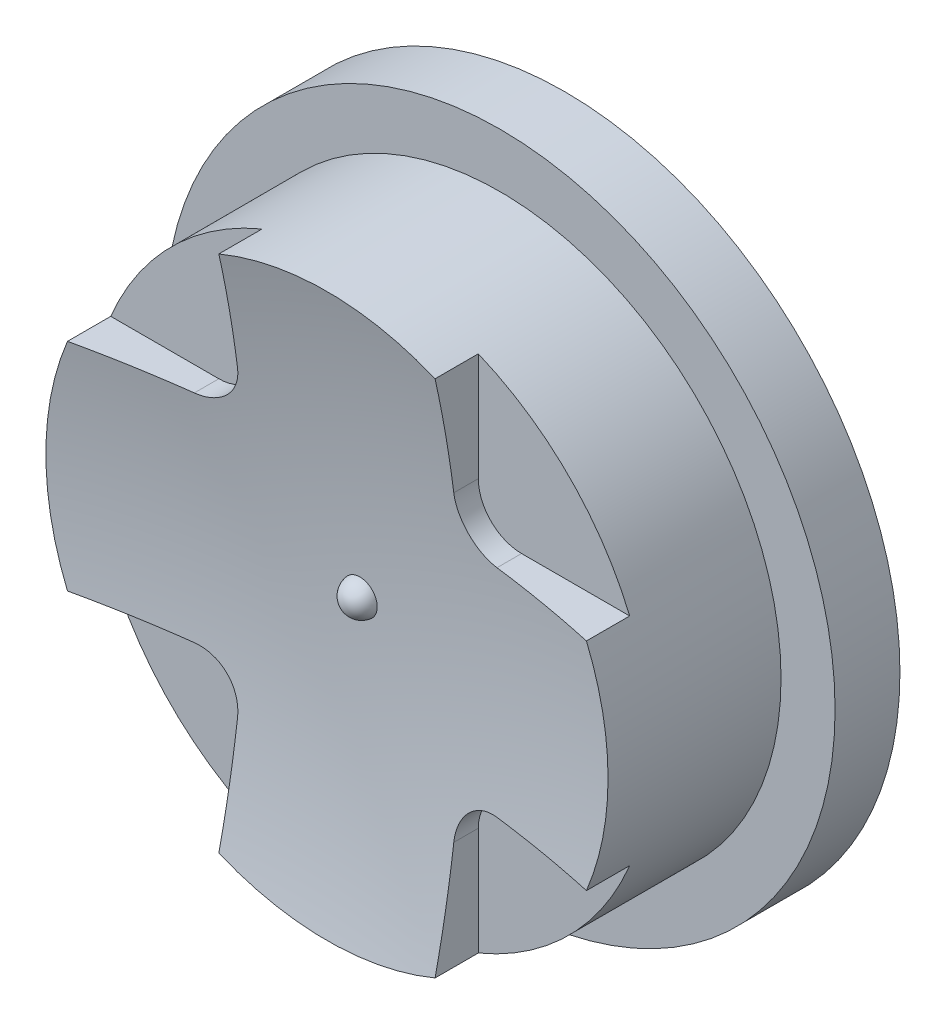
ISO-10303-21;
HEADER;
FILE_DESCRIPTION(('STEP AP214'),'2;1');
FILE_NAME('part.step','',(''),(''),'','','');
FILE_SCHEMA(('AUTOMOTIVE_DESIGN { 1 0 10303 214 1 1 1 1 }'));
ENDSEC;
DATA;
#1=APPLICATION_CONTEXT('core data for automotive mechanical design processes');
#2=APPLICATION_PROTOCOL_DEFINITION('international standard','automotive_design',2000,#1);
#3=PRODUCT_CONTEXT('',#1,'mechanical');
#4=PRODUCT('Part','Part','',(#3));
#5=PRODUCT_RELATED_PRODUCT_CATEGORY('part','',(#4));
#6=PRODUCT_DEFINITION_FORMATION('','',#4);
#7=PRODUCT_DEFINITION_CONTEXT('part definition',#1,'design');
#8=PRODUCT_DEFINITION('design','',#6,#7);
#9=PRODUCT_DEFINITION_SHAPE('','',#8);
#10=(LENGTH_UNIT() NAMED_UNIT(*) SI_UNIT(.MILLI.,.METRE.));
#11=(NAMED_UNIT(*) PLANE_ANGLE_UNIT() SI_UNIT($,.RADIAN.));
#12=(NAMED_UNIT(*) SI_UNIT($,.STERADIAN.) SOLID_ANGLE_UNIT());
#13=UNCERTAINTY_MEASURE_WITH_UNIT(LENGTH_MEASURE(1.E-05),#10,'distance_accuracy_value','');
#14=(GEOMETRIC_REPRESENTATION_CONTEXT(3) GLOBAL_UNCERTAINTY_ASSIGNED_CONTEXT((#13)) GLOBAL_UNIT_ASSIGNED_CONTEXT((#10,
#11,#12)) REPRESENTATION_CONTEXT('',''));
#15=CARTESIAN_POINT('',(0.,0.,0.));
#16=DIRECTION('',(0.,0.,1.));
#17=DIRECTION('',(1.,0.,0.));
#18=AXIS2_PLACEMENT_3D('',#15,#16,#17);
#19=CARTESIAN_POINT('',(0.,0.,5.5));
#20=DIRECTION('',(0.,0.,-1.));
#21=DIRECTION('',(-1.,0.,0.));
#22=AXIS2_PLACEMENT_3D('',#19,#20,#21);
#23=CYLINDRICAL_SURFACE('',#22,6.5);
#24=CARTESIAN_POINT('',(0.,0.,1.5));
#25=DIRECTION('',(0.,0.,1.));
#26=DIRECTION('',(1.,0.,0.));
#27=AXIS2_PLACEMENT_3D('',#24,#25,#26);
#28=CIRCLE('',#27,6.5);
#29=CARTESIAN_POINT('',(6.5,0.,1.5));
#30=VERTEX_POINT('',#29);
#31=EDGE_CURVE('E240',#30,#30,#28,.T.);
#32=ORIENTED_EDGE('',*,*,#31,.T.);
#33=EDGE_LOOP('',(#32));
#34=FACE_BOUND('',#33,.T.);
#35=DIRECTION('',(0.,0.,-1.));
#36=VECTOR('',#35,1.);
#37=CARTESIAN_POINT('',(2.5,6.,5.5));
#38=LINE('',#37,#36);
#39=CARTESIAN_POINT('',(2.5,6.,4.5));
#40=VERTEX_POINT('',#39);
#41=CARTESIAN_POINT('',(2.5,5.99999999999987,5.49999999999994));
#42=VERTEX_POINT('',#41);
#43=EDGE_CURVE('E165',#40,#42,#38,.F.);
#44=ORIENTED_EDGE('',*,*,#43,.F.);
#45=CARTESIAN_POINT('',(0.,0.,4.5));
#46=DIRECTION('',(0.,0.,1.));
#47=DIRECTION('',(1.,0.,0.));
#48=AXIS2_PLACEMENT_3D('',#45,#46,#47);
#49=CIRCLE('',#48,6.5);
#50=CARTESIAN_POINT('',(6.,2.5,4.5));
#51=VERTEX_POINT('',#50);
#52=EDGE_CURVE('E229',#51,#40,#49,.T.);
#53=ORIENTED_EDGE('',*,*,#52,.F.);
#54=DIRECTION('',(0.,0.,-1.));
#55=VECTOR('',#54,1.);
#56=CARTESIAN_POINT('',(6.,2.5,5.5));
#57=LINE('',#56,#55);
#58=CARTESIAN_POINT('',(6.,2.5,5.5));
#59=VERTEX_POINT('',#58);
#60=EDGE_CURVE('E173',#59,#51,#57,.T.);
#61=ORIENTED_EDGE('',*,*,#60,.F.);
#62=CARTESIAN_POINT('',(0.,0.,5.5));
#63=DIRECTION('',(0.,0.,1.));
#64=DIRECTION('',(1.,0.,0.));
#65=AXIS2_PLACEMENT_3D('',#62,#63,#64);
#66=CIRCLE('',#65,6.5);
#67=CARTESIAN_POINT('',(5.99999999999984,-2.5,5.49999999999993));
#68=VERTEX_POINT('',#67);
#69=EDGE_CURVE('E172',#68,#59,#66,.T.);
#70=ORIENTED_EDGE('',*,*,#69,.F.);
#71=DIRECTION('',(0.,0.,-1.));
#72=VECTOR('',#71,1.);
#73=CARTESIAN_POINT('',(6.,-2.5,5.5));
#74=LINE('',#73,#72);
#75=CARTESIAN_POINT('',(6.,-2.5,4.5));
#76=VERTEX_POINT('',#75);
#77=EDGE_CURVE('E209',#76,#68,#74,.F.);
#78=ORIENTED_EDGE('',*,*,#77,.F.);
#79=CARTESIAN_POINT('',(2.5,-6.,4.5));
#80=VERTEX_POINT('',#79);
#81=EDGE_CURVE('E208',#80,#76,#49,.T.);
#82=ORIENTED_EDGE('',*,*,#81,.F.);
#83=DIRECTION('',(0.,0.,-1.));
#84=VECTOR('',#83,1.);
#85=CARTESIAN_POINT('',(2.5,-6.,5.5));
#86=LINE('',#85,#84);
#87=CARTESIAN_POINT('',(2.5,-5.99999999999987,5.49999999999994));
#88=VERTEX_POINT('',#87);
#89=EDGE_CURVE('E200',#88,#80,#86,.T.);
#90=ORIENTED_EDGE('',*,*,#89,.F.);
#91=CARTESIAN_POINT('',(-2.5,-5.9999999999999,5.49999999999996));
#92=VERTEX_POINT('',#91);
#93=EDGE_CURVE('E184',#92,#88,#66,.T.);
#94=ORIENTED_EDGE('',*,*,#93,.F.);
#95=DIRECTION('',(0.,0.,-1.));
#96=VECTOR('',#95,1.);
#97=CARTESIAN_POINT('',(-2.5,-6.,5.5));
#98=LINE('',#97,#96);
#99=CARTESIAN_POINT('',(-2.5,-6.,4.5));
#100=VERTEX_POINT('',#99);
#101=EDGE_CURVE('E210',#100,#92,#98,.F.);
#102=ORIENTED_EDGE('',*,*,#101,.F.);
#103=CARTESIAN_POINT('',(-6.,-2.5,4.5));
#104=VERTEX_POINT('',#103);
#105=EDGE_CURVE('E238',#104,#100,#49,.T.);
#106=ORIENTED_EDGE('',*,*,#105,.F.);
#107=DIRECTION('',(0.,0.,-1.));
#108=VECTOR('',#107,1.);
#109=CARTESIAN_POINT('',(-6.,-2.5,5.5));
#110=LINE('',#109,#108);
#111=CARTESIAN_POINT('',(-5.99999999999992,-2.5,5.49999999999997));
#112=VERTEX_POINT('',#111);
#113=EDGE_CURVE('E214',#112,#104,#110,.T.);
#114=ORIENTED_EDGE('',*,*,#113,.F.);
#115=CARTESIAN_POINT('',(-5.99999999999992,2.5,5.49999999999997));
#116=VERTEX_POINT('',#115);
#117=EDGE_CURVE('E179',#116,#112,#66,.T.);
#118=ORIENTED_EDGE('',*,*,#117,.F.);
#119=DIRECTION('',(0.,0.,-1.));
#120=VECTOR('',#119,1.);
#121=CARTESIAN_POINT('',(-6.,2.5,5.5));
#122=LINE('',#121,#120);
#123=CARTESIAN_POINT('',(-6.,2.5,4.5));
#124=VERTEX_POINT('',#123);
#125=EDGE_CURVE('E388',#124,#116,#122,.F.);
#126=ORIENTED_EDGE('',*,*,#125,.F.);
#127=CARTESIAN_POINT('',(-2.5,6.,4.5));
#128=VERTEX_POINT('',#127);
#129=EDGE_CURVE('E235',#128,#124,#49,.T.);
#130=ORIENTED_EDGE('',*,*,#129,.F.);
#131=DIRECTION('',(0.,0.,-1.));
#132=VECTOR('',#131,1.);
#133=CARTESIAN_POINT('',(-2.5,6.,5.5));
#134=LINE('',#133,#132);
#135=CARTESIAN_POINT('',(-2.5,5.9999999999999,5.49999999999996));
#136=VERTEX_POINT('',#135);
#137=EDGE_CURVE('E177',#136,#128,#134,.T.);
#138=ORIENTED_EDGE('',*,*,#137,.F.);
#139=EDGE_CURVE('E155',#42,#136,#66,.T.);
#140=ORIENTED_EDGE('',*,*,#139,.F.);
#141=EDGE_LOOP('',(#44,#53,#61,#70,#78,#82,#90,#94,#102,#106,#114,#118,#126,#130,#138,#140));
#142=FACE_BOUND('',#141,.T.);
#143=ADVANCED_FACE('F35',(#34,#142),#23,.T.);
#144=CARTESIAN_POINT('',(0.,0.,1.5));
#145=DIRECTION('',(0.,0.,-1.));
#146=DIRECTION('',(-1.,0.,0.));
#147=AXIS2_PLACEMENT_3D('',#144,#145,#146);
#148=CYLINDRICAL_SURFACE('',#147,7.75);
#149=CARTESIAN_POINT('',(0.,0.,1.5));
#150=DIRECTION('',(0.,0.,1.));
#151=DIRECTION('',(1.,0.,0.));
#152=AXIS2_PLACEMENT_3D('',#149,#150,#151);
#153=CIRCLE('',#152,7.75);
#154=CARTESIAN_POINT('',(7.75,0.,1.5));
#155=VERTEX_POINT('',#154);
#156=EDGE_CURVE('E182',#155,#155,#153,.T.);
#157=ORIENTED_EDGE('',*,*,#156,.F.);
#158=EDGE_LOOP('',(#157));
#159=FACE_BOUND('',#158,.T.);
#160=CARTESIAN_POINT('',(0.,0.,0.));
#161=DIRECTION('',(0.,0.,1.));
#162=DIRECTION('',(1.,0.,0.));
#163=AXIS2_PLACEMENT_3D('',#160,#161,#162);
#164=CIRCLE('',#163,7.75);
#165=CARTESIAN_POINT('',(7.75,0.,0.));
#166=VERTEX_POINT('',#165);
#167=EDGE_CURVE('E178',#166,#166,#164,.T.);
#168=ORIENTED_EDGE('',*,*,#167,.T.);
#169=EDGE_LOOP('',(#168));
#170=FACE_BOUND('',#169,.T.);
#171=ADVANCED_FACE('F255',(#159,#170),#148,.T.);
#172=CARTESIAN_POINT('',(0.,0.,1.5));
#173=DIRECTION('',(0.,0.,1.));
#174=DIRECTION('',(1.,0.,0.));
#175=AXIS2_PLACEMENT_3D('',#172,#173,#174);
#176=PLANE('',#175);
#177=ORIENTED_EDGE('',*,*,#31,.F.);
#178=EDGE_LOOP('',(#177));
#179=FACE_BOUND('',#178,.T.);
#180=ORIENTED_EDGE('',*,*,#156,.T.);
#181=EDGE_LOOP('',(#180));
#182=FACE_BOUND('',#181,.T.);
#183=ADVANCED_FACE('F253',(#179,#182),#176,.T.);
#184=CARTESIAN_POINT('',(0.,0.,0.));
#185=DIRECTION('',(0.,0.,1.));
#186=DIRECTION('',(1.,0.,0.));
#187=AXIS2_PLACEMENT_3D('',#184,#185,#186);
#188=PLANE('',#187);
#189=ORIENTED_EDGE('',*,*,#167,.F.);
#190=EDGE_LOOP('',(#189));
#191=FACE_BOUND('',#190,.T.);
#192=ADVANCED_FACE('F261',(#191),#188,.F.);
#193=CARTESIAN_POINT('',(-2.5,7.5,4.5));
#194=DIRECTION('',(-1.,0.,0.));
#195=DIRECTION('',(0.,0.,1.));
#196=AXIS2_PLACEMENT_3D('',#193,#194,#195);
#197=PLANE('',#196);
#198=DIRECTION('',(0.,-1.,0.));
#199=VECTOR('',#198,1.);
#200=CARTESIAN_POINT('',(-2.5,7.5,4.5));
#201=LINE('',#200,#199);
#202=CARTESIAN_POINT('',(-2.5,3.5,4.5));
#203=VERTEX_POINT('',#202);
#204=EDGE_CURVE('E394',#128,#203,#201,.T.);
#205=ORIENTED_EDGE('',*,*,#204,.T.);
#206=DIRECTION('',(0.,0.,1.));
#207=VECTOR('',#206,1.);
#208=CARTESIAN_POINT('',(-2.5,3.5,4.95919883813034));
#209=LINE('',#208,#207);
#210=CARTESIAN_POINT('',(-2.5,3.5,5.06741699827879));
#211=VERTEX_POINT('',#210);
#212=EDGE_CURVE('E357',#203,#211,#209,.T.);
#213=ORIENTED_EDGE('',*,*,#212,.T.);
#214=CARTESIAN_POINT('',(-2.5,0.,32.7350876627926));
#215=DIRECTION('',(-1.,0.,0.));
#216=DIRECTION('',(0.,0.,1.));
#217=AXIS2_PLACEMENT_3D('',#214,#215,#216);
#218=CIRCLE('',#217,27.8881695347687);
#219=EDGE_CURVE('E385',#136,#211,#218,.T.);
#220=ORIENTED_EDGE('',*,*,#219,.F.);
#221=ORIENTED_EDGE('',*,*,#137,.T.);
#222=EDGE_LOOP('',(#205,#213,#220,#221));
#223=FACE_BOUND('',#222,.T.);
#224=ADVANCED_FACE('F263',(#223),#197,.T.);
#225=CARTESIAN_POINT('',(-2.5,2.5,4.5));
#226=DIRECTION('',(0.,1.,0.));
#227=DIRECTION('',(-1.,0.,0.));
#228=AXIS2_PLACEMENT_3D('',#225,#226,#227);
#229=PLANE('',#228);
#230=CARTESIAN_POINT('',(0.,2.5,32.7350876627926));
#231=DIRECTION('',(0.,1.,0.));
#232=DIRECTION('',(-1.,0.,0.));
#233=AXIS2_PLACEMENT_3D('',#230,#231,#232);
#234=CIRCLE('',#233,27.8881695347687);
#235=CARTESIAN_POINT('',(-3.5,2.5,5.06741699827879));
#236=VERTEX_POINT('',#235);
#237=EDGE_CURVE('E383',#236,#116,#234,.T.);
#238=ORIENTED_EDGE('',*,*,#237,.F.);
#239=DIRECTION('',(0.,0.,1.));
#240=VECTOR('',#239,1.);
#241=CARTESIAN_POINT('',(-3.5,2.5,4.5));
#242=LINE('',#241,#240);
#243=CARTESIAN_POINT('',(-3.5,2.5,4.5));
#244=VERTEX_POINT('',#243);
#245=EDGE_CURVE('E360',#236,#244,#242,.F.);
#246=ORIENTED_EDGE('',*,*,#245,.T.);
#247=DIRECTION('',(-1.,0.,0.));
#248=VECTOR('',#247,1.);
#249=CARTESIAN_POINT('',(-2.5,2.5,4.5));
#250=LINE('',#249,#248);
#251=EDGE_CURVE('E395',#244,#124,#250,.T.);
#252=ORIENTED_EDGE('',*,*,#251,.T.);
#253=ORIENTED_EDGE('',*,*,#125,.T.);
#254=EDGE_LOOP('',(#238,#246,#252,#253));
#255=FACE_BOUND('',#254,.T.);
#256=ADVANCED_FACE('F269',(#255),#229,.T.);
#257=CARTESIAN_POINT('',(0.,0.,4.5));
#258=DIRECTION('',(0.,0.,1.));
#259=DIRECTION('',(1.,0.,0.));
#260=AXIS2_PLACEMENT_3D('',#257,#258,#259);
#261=PLANE('',#260);
#262=ORIENTED_EDGE('',*,*,#251,.F.);
#263=CARTESIAN_POINT('',(-3.5,3.5,4.5));
#264=DIRECTION('',(0.,0.,1.));
#265=DIRECTION('',(1.,0.,0.));
#266=AXIS2_PLACEMENT_3D('',#263,#264,#265);
#267=CIRCLE('',#266,1.);
#268=EDGE_CURVE('E362',#244,#203,#267,.T.);
#269=ORIENTED_EDGE('',*,*,#268,.T.);
#270=ORIENTED_EDGE('',*,*,#204,.F.);
#271=ORIENTED_EDGE('',*,*,#129,.T.);
#272=EDGE_LOOP('',(#262,#269,#270,#271));
#273=FACE_BOUND('',#272,.T.);
#274=ADVANCED_FACE('F281',(#273),#261,.T.);
#275=CARTESIAN_POINT('',(-7.5,-2.5,4.5));
#276=DIRECTION('',(0.,-1.,0.));
#277=DIRECTION('',(1.,0.,0.));
#278=AXIS2_PLACEMENT_3D('',#275,#276,#277);
#279=PLANE('',#278);
#280=DIRECTION('',(1.,0.,0.));
#281=VECTOR('',#280,1.);
#282=CARTESIAN_POINT('',(-7.5,-2.5,4.5));
#283=LINE('',#282,#281);
#284=CARTESIAN_POINT('',(-3.5,-2.5,4.5));
#285=VERTEX_POINT('',#284);
#286=EDGE_CURVE('E397',#104,#285,#283,.T.);
#287=ORIENTED_EDGE('',*,*,#286,.T.);
#288=DIRECTION('',(0.,0.,1.));
#289=VECTOR('',#288,1.);
#290=CARTESIAN_POINT('',(-3.5,-2.5,4.95919883813034));
#291=LINE('',#290,#289);
#292=CARTESIAN_POINT('',(-3.5,-2.5,5.06741699827879));
#293=VERTEX_POINT('',#292);
#294=EDGE_CURVE('E374',#285,#293,#291,.T.);
#295=ORIENTED_EDGE('',*,*,#294,.T.);
#296=CARTESIAN_POINT('',(0.,-2.5,32.7350876627926));
#297=DIRECTION('',(0.,-1.,0.));
#298=DIRECTION('',(1.,0.,0.));
#299=AXIS2_PLACEMENT_3D('',#296,#297,#298);
#300=CIRCLE('',#299,27.8881695347687);
#301=EDGE_CURVE('E390',#112,#293,#300,.T.);
#302=ORIENTED_EDGE('',*,*,#301,.F.);
#303=ORIENTED_EDGE('',*,*,#113,.T.);
#304=EDGE_LOOP('',(#287,#295,#302,#303));
#305=FACE_BOUND('',#304,.T.);
#306=ADVANCED_FACE('F286',(#305),#279,.T.);
#307=CARTESIAN_POINT('',(-2.5,-2.5,4.5));
#308=DIRECTION('',(-1.,0.,0.));
#309=DIRECTION('',(0.,0.,1.));
#310=AXIS2_PLACEMENT_3D('',#307,#308,#309);
#311=PLANE('',#310);
#312=CARTESIAN_POINT('',(-2.5,0.,32.7350876627926));
#313=DIRECTION('',(-1.,0.,0.));
#314=DIRECTION('',(0.,0.,1.));
#315=AXIS2_PLACEMENT_3D('',#312,#313,#314);
#316=CIRCLE('',#315,27.8881695347687);
#317=CARTESIAN_POINT('',(-2.5,-3.5,5.06741699827879));
#318=VERTEX_POINT('',#317);
#319=EDGE_CURVE('E192',#318,#92,#316,.T.);
#320=ORIENTED_EDGE('',*,*,#319,.F.);
#321=DIRECTION('',(0.,0.,1.));
#322=VECTOR('',#321,1.);
#323=CARTESIAN_POINT('',(-2.5,-3.5,4.5));
#324=LINE('',#323,#322);
#325=CARTESIAN_POINT('',(-2.5,-3.5,4.5));
#326=VERTEX_POINT('',#325);
#327=EDGE_CURVE('E56',#318,#326,#324,.F.);
#328=ORIENTED_EDGE('',*,*,#327,.T.);
#329=DIRECTION('',(0.,-1.,0.));
#330=VECTOR('',#329,1.);
#331=CARTESIAN_POINT('',(-2.5,-2.5,4.5));
#332=LINE('',#331,#330);
#333=EDGE_CURVE('E402',#326,#100,#332,.T.);
#334=ORIENTED_EDGE('',*,*,#333,.T.);
#335=ORIENTED_EDGE('',*,*,#101,.T.);
#336=EDGE_LOOP('',(#320,#328,#334,#335));
#337=FACE_BOUND('',#336,.T.);
#338=ADVANCED_FACE('F289',(#337),#311,.T.);
#339=ORIENTED_EDGE('',*,*,#333,.F.);
#340=CARTESIAN_POINT('',(-3.5,-3.5,4.5));
#341=DIRECTION('',(0.,0.,1.));
#342=DIRECTION('',(1.,0.,0.));
#343=AXIS2_PLACEMENT_3D('',#340,#341,#342);
#344=CIRCLE('',#343,1.);
#345=EDGE_CURVE('E377',#326,#285,#344,.T.);
#346=ORIENTED_EDGE('',*,*,#345,.T.);
#347=ORIENTED_EDGE('',*,*,#286,.F.);
#348=ORIENTED_EDGE('',*,*,#105,.T.);
#349=EDGE_LOOP('',(#339,#346,#347,#348));
#350=FACE_BOUND('',#349,.T.);
#351=ADVANCED_FACE('F293',(#350),#261,.T.);
#352=CARTESIAN_POINT('',(2.5,-7.5,4.5));
#353=DIRECTION('',(1.,0.,0.));
#354=DIRECTION('',(0.,0.,-1.));
#355=AXIS2_PLACEMENT_3D('',#352,#353,#354);
#356=PLANE('',#355);
#357=DIRECTION('',(0.,1.,0.));
#358=VECTOR('',#357,1.);
#359=CARTESIAN_POINT('',(2.5,-7.5,4.5));
#360=LINE('',#359,#358);
#361=CARTESIAN_POINT('',(2.5,-3.5,4.5));
#362=VERTEX_POINT('',#361);
#363=EDGE_CURVE('E404',#80,#362,#360,.T.);
#364=ORIENTED_EDGE('',*,*,#363,.T.);
#365=DIRECTION('',(0.,0.,1.));
#366=VECTOR('',#365,1.);
#367=CARTESIAN_POINT('',(2.5,-3.5,4.95919883813034));
#368=LINE('',#367,#366);
#369=CARTESIAN_POINT('',(2.5,-3.5,5.06741699827879));
#370=VERTEX_POINT('',#369);
#371=EDGE_CURVE('E203',#362,#370,#368,.T.);
#372=ORIENTED_EDGE('',*,*,#371,.T.);
#373=CARTESIAN_POINT('',(2.5,0.,32.7350876627926));
#374=DIRECTION('',(1.,0.,0.));
#375=DIRECTION('',(0.,0.,-1.));
#376=AXIS2_PLACEMENT_3D('',#373,#374,#375);
#377=CIRCLE('',#376,27.8881695347687);
#378=EDGE_CURVE('E191',#88,#370,#377,.T.);
#379=ORIENTED_EDGE('',*,*,#378,.F.);
#380=ORIENTED_EDGE('',*,*,#89,.T.);
#381=EDGE_LOOP('',(#364,#372,#379,#380));
#382=FACE_BOUND('',#381,.T.);
#383=ADVANCED_FACE('F199',(#382),#356,.T.);
#384=CARTESIAN_POINT('',(2.5,-2.5,4.5));
#385=DIRECTION('',(0.,-1.,0.));
#386=DIRECTION('',(1.,0.,0.));
#387=AXIS2_PLACEMENT_3D('',#384,#385,#386);
#388=PLANE('',#387);
#389=CARTESIAN_POINT('',(0.,-2.5,32.7350876627926));
#390=DIRECTION('',(0.,-1.,0.));
#391=DIRECTION('',(1.,0.,0.));
#392=AXIS2_PLACEMENT_3D('',#389,#390,#391);
#393=CIRCLE('',#392,27.8881695347687);
#394=CARTESIAN_POINT('',(3.5,-2.5,5.06741699827879));
#395=VERTEX_POINT('',#394);
#396=EDGE_CURVE('E161',#395,#68,#393,.T.);
#397=ORIENTED_EDGE('',*,*,#396,.F.);
#398=DIRECTION('',(0.,0.,1.));
#399=VECTOR('',#398,1.);
#400=CARTESIAN_POINT('',(3.5,-2.5,4.5));
#401=LINE('',#400,#399);
#402=CARTESIAN_POINT('',(3.5,-2.5,4.5));
#403=VERTEX_POINT('',#402);
#404=EDGE_CURVE('E370',#395,#403,#401,.F.);
#405=ORIENTED_EDGE('',*,*,#404,.T.);
#406=DIRECTION('',(1.,0.,0.));
#407=VECTOR('',#406,1.);
#408=CARTESIAN_POINT('',(2.5,-2.5,4.5));
#409=LINE('',#408,#407);
#410=EDGE_CURVE('E232',#403,#76,#409,.T.);
#411=ORIENTED_EDGE('',*,*,#410,.T.);
#412=ORIENTED_EDGE('',*,*,#77,.T.);
#413=EDGE_LOOP('',(#397,#405,#411,#412));
#414=FACE_BOUND('',#413,.T.);
#415=ADVANCED_FACE('F296',(#414),#388,.T.);
#416=ORIENTED_EDGE('',*,*,#410,.F.);
#417=CARTESIAN_POINT('',(3.5,-3.5,4.5));
#418=DIRECTION('',(0.,0.,1.));
#419=DIRECTION('',(1.,0.,0.));
#420=AXIS2_PLACEMENT_3D('',#417,#418,#419);
#421=CIRCLE('',#420,1.);
#422=EDGE_CURVE('E372',#403,#362,#421,.T.);
#423=ORIENTED_EDGE('',*,*,#422,.T.);
#424=ORIENTED_EDGE('',*,*,#363,.F.);
#425=ORIENTED_EDGE('',*,*,#81,.T.);
#426=EDGE_LOOP('',(#416,#423,#424,#425));
#427=FACE_BOUND('',#426,.T.);
#428=ADVANCED_FACE('F280',(#427),#261,.T.);
#429=DIRECTION('',(0.,1.,0.));
#430=VECTOR('',#429,1.);
#431=CARTESIAN_POINT('',(2.5,2.5,4.5));
#432=LINE('',#431,#430);
#433=CARTESIAN_POINT('',(2.5,3.5,4.5));
#434=VERTEX_POINT('',#433);
#435=EDGE_CURVE('E168',#434,#40,#432,.T.);
#436=ORIENTED_EDGE('',*,*,#435,.F.);
#437=CARTESIAN_POINT('',(3.5,3.5,4.5));
#438=DIRECTION('',(0.,0.,1.));
#439=DIRECTION('',(1.,0.,0.));
#440=AXIS2_PLACEMENT_3D('',#437,#438,#439);
#441=CIRCLE('',#440,1.);
#442=CARTESIAN_POINT('',(3.5,2.5,4.5));
#443=VERTEX_POINT('',#442);
#444=EDGE_CURVE('E231',#434,#443,#441,.T.);
#445=ORIENTED_EDGE('',*,*,#444,.T.);
#446=DIRECTION('',(-1.,0.,0.));
#447=VECTOR('',#446,1.);
#448=CARTESIAN_POINT('',(7.5,2.5,4.5));
#449=LINE('',#448,#447);
#450=EDGE_CURVE('E224',#51,#443,#449,.T.);
#451=ORIENTED_EDGE('',*,*,#450,.F.);
#452=ORIENTED_EDGE('',*,*,#52,.T.);
#453=EDGE_LOOP('',(#436,#445,#451,#452));
#454=FACE_BOUND('',#453,.T.);
#455=ADVANCED_FACE('F228',(#454),#261,.T.);
#456=CARTESIAN_POINT('',(2.5,2.5,4.5));
#457=DIRECTION('',(1.,0.,0.));
#458=DIRECTION('',(0.,1.,0.));
#459=AXIS2_PLACEMENT_3D('',#456,#457,#458);
#460=PLANE('',#459);
#461=CARTESIAN_POINT('',(2.5,0.,32.7350876627926));
#462=DIRECTION('',(1.,0.,0.));
#463=DIRECTION('',(0.,1.,0.));
#464=AXIS2_PLACEMENT_3D('',#461,#462,#463);
#465=CIRCLE('',#464,27.8881695347687);
#466=CARTESIAN_POINT('',(2.5,3.5,5.06741699827879));
#467=VERTEX_POINT('',#466);
#468=EDGE_CURVE('E150',#467,#42,#465,.T.);
#469=ORIENTED_EDGE('',*,*,#468,.F.);
#470=DIRECTION('',(0.,0.,1.));
#471=VECTOR('',#470,1.);
#472=CARTESIAN_POINT('',(2.5,3.5,4.5));
#473=LINE('',#472,#471);
#474=EDGE_CURVE('E366',#467,#434,#473,.F.);
#475=ORIENTED_EDGE('',*,*,#474,.T.);
#476=ORIENTED_EDGE('',*,*,#435,.T.);
#477=ORIENTED_EDGE('',*,*,#43,.T.);
#478=EDGE_LOOP('',(#469,#475,#476,#477));
#479=FACE_BOUND('',#478,.T.);
#480=ADVANCED_FACE('F166',(#479),#460,.T.);
#481=CARTESIAN_POINT('',(7.5,2.5,4.5));
#482=DIRECTION('',(0.,1.,0.));
#483=DIRECTION('',(-1.,0.,0.));
#484=AXIS2_PLACEMENT_3D('',#481,#482,#483);
#485=PLANE('',#484);
#486=ORIENTED_EDGE('',*,*,#450,.T.);
#487=DIRECTION('',(0.,0.,1.));
#488=VECTOR('',#487,1.);
#489=CARTESIAN_POINT('',(3.5,2.5,4.95919883813034));
#490=LINE('',#489,#488);
#491=CARTESIAN_POINT('',(3.5,2.5,5.06741699827879));
#492=VERTEX_POINT('',#491);
#493=EDGE_CURVE('E364',#443,#492,#490,.T.);
#494=ORIENTED_EDGE('',*,*,#493,.T.);
#495=CARTESIAN_POINT('',(0.,2.5,32.7350876627926));
#496=DIRECTION('',(0.,1.,0.));
#497=DIRECTION('',(-1.,0.,0.));
#498=AXIS2_PLACEMENT_3D('',#495,#496,#497);
#499=CIRCLE('',#498,27.8881695347687);
#500=EDGE_CURVE('E226',#59,#492,#499,.T.);
#501=ORIENTED_EDGE('',*,*,#500,.F.);
#502=ORIENTED_EDGE('',*,*,#60,.T.);
#503=EDGE_LOOP('',(#486,#494,#501,#502));
#504=FACE_BOUND('',#503,.T.);
#505=ADVANCED_FACE('F222',(#504),#485,.T.);
#506=CARTESIAN_POINT('',(0.,0.,32.7350876627926));
#507=DIRECTION('',(0.,0.,1.));
#508=DIRECTION('',(1.,0.,0.));
#509=AXIS2_PLACEMENT_3D('',#506,#507,#508);
#510=SPHERICAL_SURFACE('',#509,28.);
#511=CARTESIAN_POINT('',(0.,0.,4.73794495143726));
#512=DIRECTION('',(0.,0.,1.));
#513=DIRECTION('',(1.,0.,0.));
#514=AXIS2_PLACEMENT_3D('',#511,#512,#513);
#515=CIRCLE('',#514,0.4);
#516=CARTESIAN_POINT('',(0.4,0.,4.73794495143726));
#517=VERTEX_POINT('',#516);
#518=EDGE_CURVE('E162',#517,#517,#515,.F.);
#519=ORIENTED_EDGE('',*,*,#518,.T.);
#520=EDGE_LOOP('',(#519));
#521=FACE_BOUND('',#520,.T.);
#522=ORIENTED_EDGE('',*,*,#219,.T.);
#523=CARTESIAN_POINT('',(-2.5,3.5,5.06741699827879));
#524=CARTESIAN_POINT('',(-2.50000021804297,3.47218567729415,5.06389847407253));
#525=CARTESIAN_POINT('',(-2.50116122411679,3.44436559234532,5.06052673356856));
#526=CARTESIAN_POINT('',(-2.50580244963402,3.38888248924157,5.0540975115053));
#527=CARTESIAN_POINT('',(-2.50928272547659,3.36121947492273,5.05104003759032));
#528=CARTESIAN_POINT('',(-2.52318736078463,3.27878895767948,5.04237744578516));
#529=CARTESIAN_POINT('',(-2.53707554747207,3.22451037980922,5.03727335737736));
#530=CARTESIAN_POINT('',(-2.57377173140816,3.1189060343381,5.0285672253571));
#531=CARTESIAN_POINT('',(-2.59658709219534,3.06758274458708,5.02496642680747));
#532=CARTESIAN_POINT('',(-2.65052102442326,2.96941671179223,5.01938013575362));
#533=CARTESIAN_POINT('',(-2.68163674067982,2.92257243555506,5.01739408875086));
#534=CARTESIAN_POINT('',(-2.75099559763378,2.83510762735347,5.0151078875438));
#535=CARTESIAN_POINT('',(-2.78917552419931,2.7944373067977,5.01479346413755));
#536=CARTESIAN_POINT('',(-2.8717530926428,2.72000292305977,5.01582165263599));
#537=CARTESIAN_POINT('',(-2.91615163297831,2.68623985956699,5.01716450420108));
#538=CARTESIAN_POINT('',(-3.00969629846034,2.62669245717455,5.02145774440551));
#539=CARTESIAN_POINT('',(-3.05882383342551,2.60087842603389,5.02440203420849));
#540=CARTESIAN_POINT('',(-3.1605654467805,2.55775064284916,5.03180625078943));
#541=CARTESIAN_POINT('',(-3.21317832839258,2.54043399002134,5.03626565946422));
#542=CARTESIAN_POINT('',(-3.30501940659541,2.51840311871673,5.04508846170455));
#543=CARTESIAN_POINT('',(-3.34377125625602,2.51150090084505,5.04911442988124));
#544=CARTESIAN_POINT('',(-3.42169034607806,2.50229877349762,5.05780284281076));
#545=CARTESIAN_POINT('',(-3.4608569104928,2.49999227511871,5.06246436609848));
#546=CARTESIAN_POINT('',(-3.5,2.5,5.0674169982788));
#547=B_SPLINE_CURVE_WITH_KNOTS('',3,(#523,#524,#525,#526,#527,#528,#529,#530,#531,#532,#533,
#534,#535,#536,#537,#538,#539,#540,#541,#542,#543,#544,#545,#546),.UNSPECIFIED.,.F.,.F.,(4,2,2,
2,2,2,2,2,2,2,2,4),(0.,0.0840578672198252,0.168117778603051,0.336029787145931,0.504080590103392,
0.672073660756248,0.838630390298266,1.00521120861844,1.17116202614807,1.33705615290882,
1.4554961857463,1.57376628805326),.UNSPECIFIED.);
#548=EDGE_CURVE('E311',#211,#236,#547,.T.);
#549=ORIENTED_EDGE('',*,*,#548,.T.);
#550=ORIENTED_EDGE('',*,*,#237,.T.);
#551=ORIENTED_EDGE('',*,*,#117,.T.);
#552=ORIENTED_EDGE('',*,*,#301,.T.);
#553=CARTESIAN_POINT('',(-3.5,-2.5,5.06741699827879));
#554=CARTESIAN_POINT('',(-3.47218567729415,-2.50000021804297,5.06389847407253));
#555=CARTESIAN_POINT('',(-3.44436559234532,-2.50116122411679,5.06052673356856));
#556=CARTESIAN_POINT('',(-3.38888248924157,-2.50580244963402,5.0540975115053));
#557=CARTESIAN_POINT('',(-3.36121947492273,-2.50928272547659,5.05104003759032));
#558=CARTESIAN_POINT('',(-3.27878895767948,-2.52318736078463,5.04237744578516));
#559=CARTESIAN_POINT('',(-3.22451037980922,-2.53707554747207,5.03727335737736));
#560=CARTESIAN_POINT('',(-3.1189060343381,-2.57377173140816,5.0285672253571));
#561=CARTESIAN_POINT('',(-3.06758274458708,-2.59658709219535,5.02496642680747));
#562=CARTESIAN_POINT('',(-2.96941671179223,-2.65052102442326,5.01938013575362));
#563=CARTESIAN_POINT('',(-2.92257243555506,-2.68163674067982,5.01739408875086));
#564=CARTESIAN_POINT('',(-2.83510762735347,-2.75099559763378,5.0151078875438));
#565=CARTESIAN_POINT('',(-2.7944373067977,-2.78917552419931,5.01479346413755));
#566=CARTESIAN_POINT('',(-2.72000292305977,-2.8717530926428,5.01582165263599));
#567=CARTESIAN_POINT('',(-2.68623985956699,-2.91615163297831,5.01716450420108));
#568=CARTESIAN_POINT('',(-2.62669245717455,-3.00969629846034,5.02145774440551));
#569=CARTESIAN_POINT('',(-2.60087842603389,-3.05882383342551,5.02440203420849));
#570=CARTESIAN_POINT('',(-2.55775064284916,-3.1605654467805,5.03180625078943));
#571=CARTESIAN_POINT('',(-2.54043399002134,-3.21317832839258,5.03626565946422));
#572=CARTESIAN_POINT('',(-2.51840311871673,-3.30501940659541,5.04508846170455));
#573=CARTESIAN_POINT('',(-2.51150090084505,-3.34377125625602,5.04911442988124));
#574=CARTESIAN_POINT('',(-2.50229877349762,-3.42169034607806,5.05780284281076));
#575=CARTESIAN_POINT('',(-2.49999227511871,-3.46085691049281,5.06246436609848));
#576=CARTESIAN_POINT('',(-2.5,-3.5,5.0674169982788));
#577=B_SPLINE_CURVE_WITH_KNOTS('',3,(#553,#554,#555,#556,#557,#558,#559,#560,#561,#562,#563,
#564,#565,#566,#567,#568,#569,#570,#571,#572,#573,#574,#575,#576),.UNSPECIFIED.,.F.,.F.,(4,2,2,
2,2,2,2,2,2,2,2,4),(0.,0.0840578672198252,0.168117778603051,0.336029787145931,0.504080590103392,
0.672073660756248,0.838630390298266,1.00521120861844,1.17116202614807,1.33705615290882,
1.4554961857463,1.57376628805326),.UNSPECIFIED.);
#578=EDGE_CURVE('E11',#293,#318,#577,.T.);
#579=ORIENTED_EDGE('',*,*,#578,.T.);
#580=ORIENTED_EDGE('',*,*,#319,.T.);
#581=ORIENTED_EDGE('',*,*,#93,.T.);
#582=ORIENTED_EDGE('',*,*,#378,.T.);
#583=CARTESIAN_POINT('',(2.5,-3.5,5.06741699827879));
#584=CARTESIAN_POINT('',(2.50000021804297,-3.47218567729415,5.06389847407253));
#585=CARTESIAN_POINT('',(2.50116122411679,-3.44436559234532,5.06052673356856));
#586=CARTESIAN_POINT('',(2.50580244963402,-3.38888248924157,5.0540975115053));
#587=CARTESIAN_POINT('',(2.50928272547659,-3.36121947492273,5.05104003759032));
#588=CARTESIAN_POINT('',(2.52318736078463,-3.27878895767948,5.04237744578516));
#589=CARTESIAN_POINT('',(2.53707554747207,-3.22451037980922,5.03727335737736));
#590=CARTESIAN_POINT('',(2.57377173140816,-3.1189060343381,5.0285672253571));
#591=CARTESIAN_POINT('',(2.59658709219534,-3.06758274458708,5.02496642680747));
#592=CARTESIAN_POINT('',(2.65052102442326,-2.96941671179223,5.01938013575362));
#593=CARTESIAN_POINT('',(2.68163674067982,-2.92257243555507,5.01739408875086));
#594=CARTESIAN_POINT('',(2.75099559763378,-2.83510762735347,5.0151078875438));
#595=CARTESIAN_POINT('',(2.78917552419931,-2.7944373067977,5.01479346413755));
#596=CARTESIAN_POINT('',(2.8717530926428,-2.72000292305977,5.01582165263599));
#597=CARTESIAN_POINT('',(2.91615163297831,-2.68623985956699,5.01716450420108));
#598=CARTESIAN_POINT('',(3.00969629846034,-2.62669245717455,5.02145774440551));
#599=CARTESIAN_POINT('',(3.05882383342551,-2.60087842603389,5.02440203420849));
#600=CARTESIAN_POINT('',(3.1605654467805,-2.55775064284917,5.03180625078943));
#601=CARTESIAN_POINT('',(3.21317832839258,-2.54043399002134,5.03626565946422));
#602=CARTESIAN_POINT('',(3.30501940659541,-2.51840311871674,5.04508846170455));
#603=CARTESIAN_POINT('',(3.34377125625602,-2.51150090084505,5.04911442988124));
#604=CARTESIAN_POINT('',(3.42169034607806,-2.50229877349762,5.05780284281076));
#605=CARTESIAN_POINT('',(3.46085691049281,-2.49999227511871,5.06246436609848));
#606=CARTESIAN_POINT('',(3.5,-2.5,5.0674169982788));
#607=B_SPLINE_CURVE_WITH_KNOTS('',3,(#583,#584,#585,#586,#587,#588,#589,#590,#591,#592,#593,
#594,#595,#596,#597,#598,#599,#600,#601,#602,#603,#604,#605,#606),.UNSPECIFIED.,.F.,.F.,(4,2,2,
2,2,2,2,2,2,2,2,4),(0.,0.0840578672198252,0.168117778603051,0.336029787145931,0.504080590103392,
0.672073660756248,0.838630390298266,1.00521120861844,1.17116202614807,1.33705615290882,
1.4554961857463,1.57376628805326),.UNSPECIFIED.);
#608=EDGE_CURVE('E49',#370,#395,#607,.T.);
#609=ORIENTED_EDGE('',*,*,#608,.T.);
#610=ORIENTED_EDGE('',*,*,#396,.T.);
#611=ORIENTED_EDGE('',*,*,#69,.T.);
#612=ORIENTED_EDGE('',*,*,#500,.T.);
#613=CARTESIAN_POINT('',(3.5,2.5,5.06741699827879));
#614=CARTESIAN_POINT('',(3.47218567729415,2.50000021804297,5.06389847407253));
#615=CARTESIAN_POINT('',(3.44436559234532,2.50116122411679,5.06052673356856));
#616=CARTESIAN_POINT('',(3.38888248924157,2.50580244963402,5.0540975115053));
#617=CARTESIAN_POINT('',(3.36121947492273,2.50928272547659,5.05104003759032));
#618=CARTESIAN_POINT('',(3.27878895767947,2.52318736078463,5.04237744578516));
#619=CARTESIAN_POINT('',(3.22451037980922,2.53707554747207,5.03727335737736));
#620=CARTESIAN_POINT('',(3.1189060343381,2.57377173140816,5.0285672253571));
#621=CARTESIAN_POINT('',(3.06758274458708,2.59658709219535,5.02496642680747));
#622=CARTESIAN_POINT('',(2.96941671179223,2.65052102442326,5.01938013575362));
#623=CARTESIAN_POINT('',(2.92257243555506,2.68163674067982,5.01739408875086));
#624=CARTESIAN_POINT('',(2.83510762735347,2.75099559763378,5.0151078875438));
#625=CARTESIAN_POINT('',(2.79443730679769,2.78917552419931,5.01479346413754));
#626=CARTESIAN_POINT('',(2.72000292305977,2.87175309264281,5.01582165263599));
#627=CARTESIAN_POINT('',(2.68623985956699,2.91615163297831,5.01716450420108));
#628=CARTESIAN_POINT('',(2.62669245717455,3.00969629846034,5.02145774440551));
#629=CARTESIAN_POINT('',(2.60087842603389,3.05882383342551,5.02440203420849));
#630=CARTESIAN_POINT('',(2.55775064284916,3.1605654467805,5.03180625078943));
#631=CARTESIAN_POINT('',(2.54043399002134,3.21317832839258,5.03626565946422));
#632=CARTESIAN_POINT('',(2.51840311871673,3.30501940659541,5.04508846170455));
#633=CARTESIAN_POINT('',(2.51150090084505,3.34377125625602,5.04911442988124));
#634=CARTESIAN_POINT('',(2.50229877349762,3.42169034607806,5.05780284281075));
#635=CARTESIAN_POINT('',(2.49999227511871,3.46085691049281,5.06246436609848));
#636=CARTESIAN_POINT('',(2.5,3.5,5.0674169982788));
#637=B_SPLINE_CURVE_WITH_KNOTS('',3,(#613,#614,#615,#616,#617,#618,#619,#620,#621,#622,#623,
#624,#625,#626,#627,#628,#629,#630,#631,#632,#633,#634,#635,#636),.UNSPECIFIED.,.F.,.F.,(4,2,2,
2,2,2,2,2,2,2,2,4),(0.,0.0840578672198256,0.168117778603052,0.336029787145932,0.504080590103393,
0.672073660756248,0.838630390298266,1.00521120861844,1.17116202614807,1.33705615290882,
1.45549618574631,1.57376628805326),.UNSPECIFIED.);
#638=EDGE_CURVE('E158',#492,#467,#637,.T.);
#639=ORIENTED_EDGE('',*,*,#638,.T.);
#640=ORIENTED_EDGE('',*,*,#468,.T.);
#641=ORIENTED_EDGE('',*,*,#139,.T.);
#642=EDGE_LOOP('',(#522,#549,#550,#551,#552,#579,#580,#581,#582,#609,#610,#611,#612,#639,#640,#641));
#643=FACE_BOUND('',#642,.T.);
#644=ADVANCED_FACE('F153',(#521,#643),#510,.F.);
#645=CARTESIAN_POINT('',(0.,0.,5.1));
#646=DIRECTION('',(0.,0.,-1.));
#647=DIRECTION('',(-1.,0.,0.));
#648=AXIS2_PLACEMENT_3D('',#645,#646,#647);
#649=PLANE('',#648);
#650=CARTESIAN_POINT('',(0.,0.,5.1));
#651=DIRECTION('',(0.,0.,-1.));
#652=DIRECTION('',(-1.,0.,0.));
#653=AXIS2_PLACEMENT_3D('',#650,#651,#652);
#654=CIRCLE('',#653,0.00180384147957405);
#655=CARTESIAN_POINT('',(-0.00180384147957405,0.,5.1));
#656=VERTEX_POINT('',#655);
#657=EDGE_CURVE('E236',#656,#656,#654,.F.);
#658=ORIENTED_EDGE('',*,*,#657,.T.);
#659=EDGE_LOOP('',(#658));
#660=FACE_BOUND('',#659,.T.);
#661=ADVANCED_FACE('F306',(#660),#649,.F.);
#662=CARTESIAN_POINT('',(0.,0.,4.7));
#663=DIRECTION('',(0.,0.,1.));
#664=DIRECTION('',(1.,0.,0.));
#665=AXIS2_PLACEMENT_3D('',#662,#663,#664);
#666=DEGENERATE_TOROIDAL_SURFACE('',#665,0.00180384147957405,0.4,.T.);
#667=ORIENTED_EDGE('',*,*,#657,.F.);
#668=EDGE_LOOP('',(#667));
#669=FACE_BOUND('',#668,.T.);
#670=ORIENTED_EDGE('',*,*,#518,.F.);
#671=EDGE_LOOP('',(#670));
#672=FACE_BOUND('',#671,.T.);
#673=ADVANCED_FACE('F341',(#669,#672),#666,.T.);
#674=CARTESIAN_POINT('',(-3.5,3.5,4.5));
#675=DIRECTION('',(0.,0.,-1.));
#676=DIRECTION('',(-1.,0.,0.));
#677=AXIS2_PLACEMENT_3D('',#674,#675,#676);
#678=CYLINDRICAL_SURFACE('',#677,1.);
#679=ORIENTED_EDGE('',*,*,#268,.F.);
#680=ORIENTED_EDGE('',*,*,#245,.F.);
#681=ORIENTED_EDGE('',*,*,#548,.F.);
#682=ORIENTED_EDGE('',*,*,#212,.F.);
#683=EDGE_LOOP('',(#679,#680,#681,#682));
#684=FACE_BOUND('',#683,.T.);
#685=ADVANCED_FACE('F336',(#684),#678,.F.);
#686=CARTESIAN_POINT('',(3.5,3.5,4.5));
#687=DIRECTION('',(0.,0.,-1.));
#688=DIRECTION('',(-1.,0.,0.));
#689=AXIS2_PLACEMENT_3D('',#686,#687,#688);
#690=CYLINDRICAL_SURFACE('',#689,1.);
#691=ORIENTED_EDGE('',*,*,#444,.F.);
#692=ORIENTED_EDGE('',*,*,#474,.F.);
#693=ORIENTED_EDGE('',*,*,#638,.F.);
#694=ORIENTED_EDGE('',*,*,#493,.F.);
#695=EDGE_LOOP('',(#691,#692,#693,#694));
#696=FACE_BOUND('',#695,.T.);
#697=ADVANCED_FACE('F332',(#696),#690,.F.);
#698=CARTESIAN_POINT('',(3.5,-3.5,4.5));
#699=DIRECTION('',(0.,0.,-1.));
#700=DIRECTION('',(-1.,0.,0.));
#701=AXIS2_PLACEMENT_3D('',#698,#699,#700);
#702=CYLINDRICAL_SURFACE('',#701,1.);
#703=ORIENTED_EDGE('',*,*,#422,.F.);
#704=ORIENTED_EDGE('',*,*,#404,.F.);
#705=ORIENTED_EDGE('',*,*,#608,.F.);
#706=ORIENTED_EDGE('',*,*,#371,.F.);
#707=EDGE_LOOP('',(#703,#704,#705,#706));
#708=FACE_BOUND('',#707,.T.);
#709=ADVANCED_FACE('F329',(#708),#702,.F.);
#710=CARTESIAN_POINT('',(-3.5,-3.5,4.5));
#711=DIRECTION('',(0.,0.,-1.));
#712=DIRECTION('',(-1.,0.,0.));
#713=AXIS2_PLACEMENT_3D('',#710,#711,#712);
#714=CYLINDRICAL_SURFACE('',#713,1.);
#715=ORIENTED_EDGE('',*,*,#345,.F.);
#716=ORIENTED_EDGE('',*,*,#327,.F.);
#717=ORIENTED_EDGE('',*,*,#578,.F.);
#718=ORIENTED_EDGE('',*,*,#294,.F.);
#719=EDGE_LOOP('',(#715,#716,#717,#718));
#720=FACE_BOUND('',#719,.T.);
#721=ADVANCED_FACE('F37',(#720),#714,.F.);
#722=CLOSED_SHELL('',(#143,#171,#183,#192,#224,#256,#274,#306,#338,#351,#383,#415,#428,#455,
#480,#505,#644,#661,#673,#685,#697,#709,#721));
#723=MANIFOLD_SOLID_BREP('B2',#722);
#724=ADVANCED_BREP_SHAPE_REPRESENTATION('',(#18,#723),#14);
#725=SHAPE_DEFINITION_REPRESENTATION(#9,#724);
ENDSEC;
END-ISO-10303-21;
